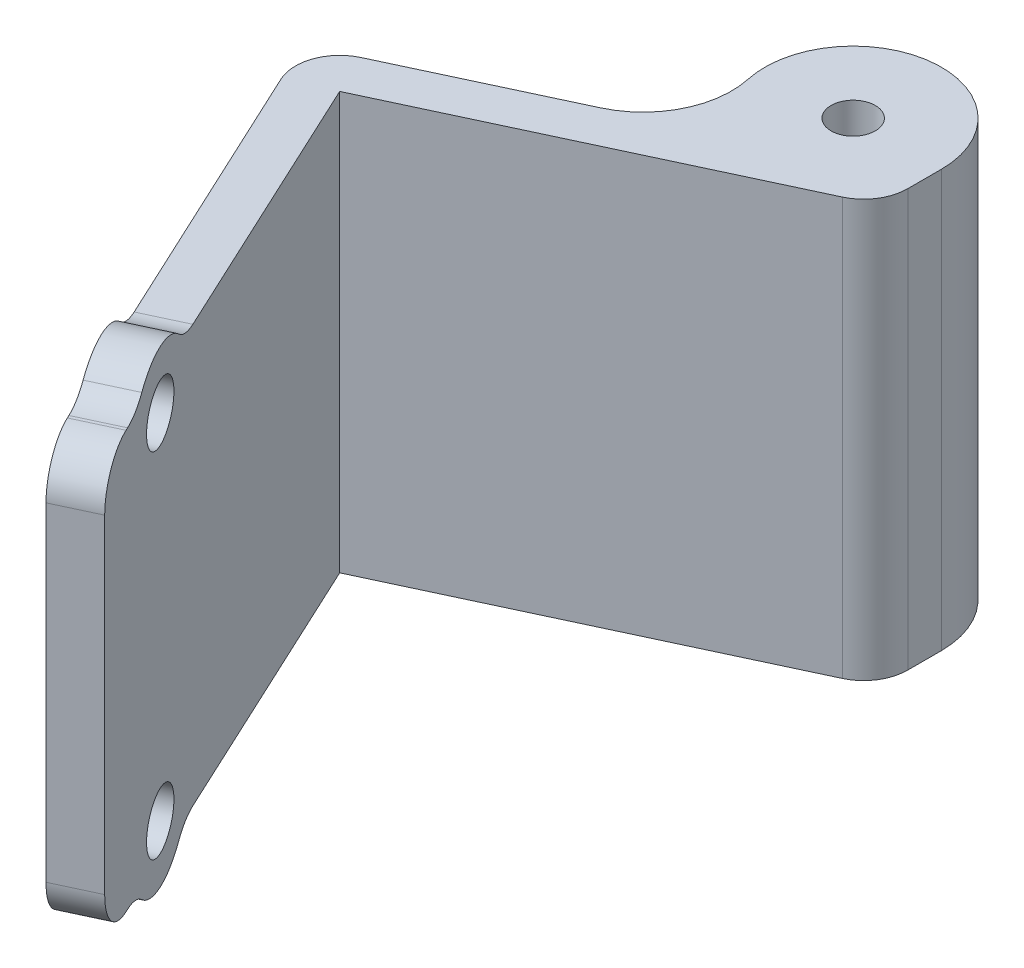
ISO-10303-21;
HEADER;
FILE_DESCRIPTION(('STEP AP214'),'2;1');
FILE_NAME('part.step','',(''),(''),'','','');
FILE_SCHEMA(('AUTOMOTIVE_DESIGN { 1 0 10303 214 1 1 1 1 }'));
ENDSEC;
DATA;
#1=APPLICATION_CONTEXT('core data for automotive mechanical design processes');
#2=APPLICATION_PROTOCOL_DEFINITION('international standard','automotive_design',2000,#1);
#3=PRODUCT_CONTEXT('',#1,'mechanical');
#4=PRODUCT('Part','Part','',(#3));
#5=PRODUCT_RELATED_PRODUCT_CATEGORY('part','',(#4));
#6=PRODUCT_DEFINITION_FORMATION('','',#4);
#7=PRODUCT_DEFINITION_CONTEXT('part definition',#1,'design');
#8=PRODUCT_DEFINITION('design','',#6,#7);
#9=PRODUCT_DEFINITION_SHAPE('','',#8);
#10=(LENGTH_UNIT() NAMED_UNIT(*) SI_UNIT(.MILLI.,.METRE.));
#11=(NAMED_UNIT(*) PLANE_ANGLE_UNIT() SI_UNIT($,.RADIAN.));
#12=(NAMED_UNIT(*) SI_UNIT($,.STERADIAN.) SOLID_ANGLE_UNIT());
#13=UNCERTAINTY_MEASURE_WITH_UNIT(LENGTH_MEASURE(1.E-05),#10,'distance_accuracy_value','');
#14=(GEOMETRIC_REPRESENTATION_CONTEXT(3) GLOBAL_UNCERTAINTY_ASSIGNED_CONTEXT((#13)) GLOBAL_UNIT_ASSIGNED_CONTEXT((#10,
#11,#12)) REPRESENTATION_CONTEXT('',''));
#15=CARTESIAN_POINT('',(0.,0.,0.));
#16=DIRECTION('',(0.,0.,1.));
#17=DIRECTION('',(1.,0.,0.));
#18=AXIS2_PLACEMENT_3D('',#15,#16,#17);
#19=CARTESIAN_POINT('',(-73.9974808663748,-364.96231219828,78.9202200200361));
#20=DIRECTION('',(0.,1.,0.));
#21=DIRECTION('',(0.,0.,1.));
#22=AXIS2_PLACEMENT_3D('',#19,#20,#21);
#23=CYLINDRICAL_SURFACE('',#22,2.5);
#24=CARTESIAN_POINT('',(-73.9974808663748,-11.8,78.9202200200361));
#25=DIRECTION('',(0.,-1.,0.));
#26=DIRECTION('',(0.,0.,-1.));
#27=AXIS2_PLACEMENT_3D('',#24,#25,#26);
#28=CIRCLE('',#27,2.5);
#29=CARTESIAN_POINT('',(-76.2632503339664,-11.8,79.9767656743879));
#30=VERTEX_POINT('',#29);
#31=CARTESIAN_POINT('',(-75.0540265207265,-11.8,76.6544505524445));
#32=VERTEX_POINT('',#31);
#33=EDGE_CURVE('E291',#30,#32,#28,.T.);
#34=ORIENTED_EDGE('',*,*,#33,.F.);
#35=DIRECTION('',(0.,-1.,0.));
#36=VECTOR('',#35,1.);
#37=CARTESIAN_POINT('',(-76.2632503339664,-364.96231219828,79.9767656743879));
#38=LINE('',#37,#36);
#39=CARTESIAN_POINT('',(-76.2632503339664,11.8,79.9767656743879));
#40=VERTEX_POINT('',#39);
#41=EDGE_CURVE('E447',#40,#30,#38,.T.);
#42=ORIENTED_EDGE('',*,*,#41,.F.);
#43=CARTESIAN_POINT('',(-73.9974808663748,11.8,78.9202200200361));
#44=DIRECTION('',(0.,1.,0.));
#45=DIRECTION('',(0.,0.,-1.));
#46=AXIS2_PLACEMENT_3D('',#43,#44,#45);
#47=CIRCLE('',#46,2.5);
#48=CARTESIAN_POINT('',(-75.0540265207265,11.8,76.6544505524445));
#49=VERTEX_POINT('',#48);
#50=EDGE_CURVE('E343',#49,#40,#47,.T.);
#51=ORIENTED_EDGE('',*,*,#50,.F.);
#52=DIRECTION('',(0.,1.,0.));
#53=VECTOR('',#52,1.);
#54=CARTESIAN_POINT('',(-75.0540265207265,-364.96231219828,76.6544505524445));
#55=LINE('',#54,#53);
#56=EDGE_CURVE('E357',#32,#49,#55,.T.);
#57=ORIENTED_EDGE('',*,*,#56,.F.);
#58=EDGE_LOOP('',(#34,#42,#51,#57));
#59=FACE_BOUND('',#58,.T.);
#60=ADVANCED_FACE('F17',(#59),#23,.T.);
#61=CARTESIAN_POINT('',(-55.6524017645318,-364.96231219828,67.6073243479813));
#62=DIRECTION('',(0.,1.,0.));
#63=DIRECTION('',(0.,0.,1.));
#64=AXIS2_PLACEMENT_3D('',#61,#62,#63);
#65=CYLINDRICAL_SURFACE('',#64,2.5);
#66=CARTESIAN_POINT('',(-55.6524017645318,-11.8,67.6073243479813));
#67=DIRECTION('',(0.,-1.,0.));
#68=DIRECTION('',(0.,0.,-1.));
#69=AXIS2_PLACEMENT_3D('',#66,#67,#68);
#70=CIRCLE('',#69,2.5);
#71=CARTESIAN_POINT('',(-53.1524017645318,-11.8,67.6073243479813));
#72=VERTEX_POINT('',#71);
#73=CARTESIAN_POINT('',(-54.5958561101801,-11.8,69.873093815573));
#74=VERTEX_POINT('',#73);
#75=EDGE_CURVE('E346',#72,#74,#70,.T.);
#76=ORIENTED_EDGE('',*,*,#75,.F.);
#77=DIRECTION('',(0.,-1.,0.));
#78=VECTOR('',#77,1.);
#79=CARTESIAN_POINT('',(-53.1524017645318,-364.96231219828,67.6073243479813));
#80=LINE('',#79,#78);
#81=CARTESIAN_POINT('',(-53.1524017645318,11.8,67.6073243479813));
#82=VERTEX_POINT('',#81);
#83=EDGE_CURVE('E377',#82,#72,#80,.T.);
#84=ORIENTED_EDGE('',*,*,#83,.F.);
#85=CARTESIAN_POINT('',(-55.6524017645318,11.8,67.6073243479813));
#86=DIRECTION('',(0.,1.,0.));
#87=DIRECTION('',(0.,0.,-1.));
#88=AXIS2_PLACEMENT_3D('',#85,#86,#87);
#89=CIRCLE('',#88,2.5);
#90=CARTESIAN_POINT('',(-54.5958561101801,11.8,69.873093815573));
#91=VERTEX_POINT('',#90);
#92=EDGE_CURVE('E279',#91,#82,#89,.T.);
#93=ORIENTED_EDGE('',*,*,#92,.F.);
#94=DIRECTION('',(0.,1.,0.));
#95=VECTOR('',#94,1.);
#96=CARTESIAN_POINT('',(-54.5958561101801,-364.96231219828,69.873093815573));
#97=LINE('',#96,#95);
#98=EDGE_CURVE('E329',#74,#91,#97,.T.);
#99=ORIENTED_EDGE('',*,*,#98,.F.);
#100=EDGE_LOOP('',(#76,#84,#93,#99));
#101=FACE_BOUND('',#100,.T.);
#102=ADVANCED_FACE('F489',(#101),#65,.T.);
#103=CARTESIAN_POINT('',(-64.5649090566531,-9.3,102.106187523128));
#104=DIRECTION('',(0.906307787036649,0.,-0.422618261740702));
#105=DIRECTION('',(-0.422618261740702,0.,-0.906307787036649));
#106=AXIS2_PLACEMENT_3D('',#103,#104,#105);
#107=CYLINDRICAL_SURFACE('',#106,2.5);
#108=CARTESIAN_POINT('',(-65.6977937904489,-9.3,102.634460350304));
#109=DIRECTION('',(-0.90630778703665,0.,0.422618261740699));
#110=DIRECTION('',(0.422618261740699,0.,0.90630778703665));
#111=AXIS2_PLACEMENT_3D('',#108,#109,#110);
#112=CIRCLE('',#111,2.5);
#113=CARTESIAN_POINT('',(-65.6977937904489,-11.8,102.634460350304));
#114=VERTEX_POINT('',#113);
#115=CARTESIAN_POINT('',(-64.6412481360972,-9.3,104.900229817896));
#116=VERTEX_POINT('',#115);
#117=EDGE_CURVE('E233',#114,#116,#112,.T.);
#118=ORIENTED_EDGE('',*,*,#117,.F.);
#119=DIRECTION('',(-0.906307787036649,0.,0.422618261740702));
#120=VECTOR('',#119,1.);
#121=CARTESIAN_POINT('',(-25.986248487577,-11.8,84.1166626584056));
#122=LINE('',#121,#120);
#123=CARTESIAN_POINT('',(-63.4320243228573,-11.8,101.577914695952));
#124=VERTEX_POINT('',#123);
#125=EDGE_CURVE('E249',#124,#114,#122,.T.);
#126=ORIENTED_EDGE('',*,*,#125,.F.);
#127=CARTESIAN_POINT('',(-63.4320243228573,-9.3,101.577914695952));
#128=DIRECTION('',(0.90630778703665,0.,-0.422618261740699));
#129=DIRECTION('',(-0.422618261740699,0.,-0.90630778703665));
#130=AXIS2_PLACEMENT_3D('',#127,#128,#129);
#131=CIRCLE('',#130,2.5);
#132=CARTESIAN_POINT('',(-62.3754786685055,-9.3,103.843684163544));
#133=VERTEX_POINT('',#132);
#134=EDGE_CURVE('E370',#133,#124,#131,.T.);
#135=ORIENTED_EDGE('',*,*,#134,.F.);
#136=DIRECTION('',(0.906307787036649,0.,-0.422618261740702));
#137=VECTOR('',#136,1.);
#138=CARTESIAN_POINT('',(-63.5083634023013,-9.3,104.37195699072));
#139=LINE('',#138,#137);
#140=EDGE_CURVE('E428',#116,#133,#139,.T.);
#141=ORIENTED_EDGE('',*,*,#140,.F.);
#142=EDGE_LOOP('',(#118,#126,#135,#141));
#143=FACE_BOUND('',#142,.T.);
#144=ADVANCED_FACE('F532',(#143),#107,.T.);
#145=CARTESIAN_POINT('',(-25.986248487577,9.3,84.1166626584056));
#146=DIRECTION('',(-0.906307787036649,0.,0.422618261740702));
#147=DIRECTION('',(0.422618261740702,0.,0.906307787036649));
#148=AXIS2_PLACEMENT_3D('',#145,#146,#147);
#149=CYLINDRICAL_SURFACE('',#148,2.5);
#150=CARTESIAN_POINT('',(-65.6977937904489,9.3,102.634460350304));
#151=DIRECTION('',(-0.90630778703665,0.,0.422618261740699));
#152=DIRECTION('',(0.422618261740699,0.,0.90630778703665));
#153=AXIS2_PLACEMENT_3D('',#150,#151,#152);
#154=CIRCLE('',#153,2.5);
#155=CARTESIAN_POINT('',(-64.6412481360972,9.3,104.900229817896));
#156=VERTEX_POINT('',#155);
#157=CARTESIAN_POINT('',(-65.6977937904489,11.8,102.634460350304));
#158=VERTEX_POINT('',#157);
#159=EDGE_CURVE('E437',#156,#158,#154,.T.);
#160=ORIENTED_EDGE('',*,*,#159,.F.);
#161=DIRECTION('',(-0.906307787036649,0.,0.422618261740702));
#162=VECTOR('',#161,1.);
#163=CARTESIAN_POINT('',(-64.6412481360972,9.3,104.900229817896));
#164=LINE('',#163,#162);
#165=CARTESIAN_POINT('',(-62.3754786685055,9.3,103.843684163544));
#166=VERTEX_POINT('',#165);
#167=EDGE_CURVE('E299',#166,#156,#164,.T.);
#168=ORIENTED_EDGE('',*,*,#167,.F.);
#169=CARTESIAN_POINT('',(-63.4320243228573,9.3,101.577914695952));
#170=DIRECTION('',(0.90630778703665,0.,-0.422618261740699));
#171=DIRECTION('',(-0.422618261740699,0.,-0.90630778703665));
#172=AXIS2_PLACEMENT_3D('',#169,#170,#171);
#173=CIRCLE('',#172,2.5);
#174=CARTESIAN_POINT('',(-63.4320243228573,11.8,101.577914695952));
#175=VERTEX_POINT('',#174);
#176=EDGE_CURVE('E406',#175,#166,#173,.T.);
#177=ORIENTED_EDGE('',*,*,#176,.F.);
#178=DIRECTION('',(0.906307787036649,0.,-0.422618261740702));
#179=VECTOR('',#178,1.);
#180=CARTESIAN_POINT('',(-63.4320243228573,11.8,101.577914695952));
#181=LINE('',#180,#179);
#182=EDGE_CURVE('E263',#158,#175,#181,.T.);
#183=ORIENTED_EDGE('',*,*,#182,.F.);
#184=EDGE_LOOP('',(#160,#168,#177,#183));
#185=FACE_BOUND('',#184,.T.);
#186=ADVANCED_FACE('F525',(#185),#149,.T.);
#187=CARTESIAN_POINT('',(-63.5073841688245,-14.3,101.411572581581));
#188=DIRECTION('',(-0.90630778703665,0.,0.422618261740699));
#189=DIRECTION('',(0.422618261740699,0.,0.90630778703665));
#190=AXIS2_PLACEMENT_3D('',#187,#188,#189);
#191=CYLINDRICAL_SURFACE('',#190,2.5);
#192=CARTESIAN_POINT('',(-63.5091967843986,-14.3,101.412417818104));
#193=DIRECTION('',(-0.90630778703665,0.,0.422618261740699));
#194=DIRECTION('',(-0.422618261740699,0.,-0.90630778703665));
#195=AXIS2_PLACEMENT_3D('',#192,#193,#194);
#196=CIRCLE('',#195,2.5);
#197=CARTESIAN_POINT('',(-63.5091967843986,-11.8,101.412417818104));
#198=VERTEX_POINT('',#197);
#199=CARTESIAN_POINT('',(-64.2106318215384,-12.4304347826087,99.9081855266702));
#200=VERTEX_POINT('',#199);
#201=EDGE_CURVE('E239',#198,#200,#196,.T.);
#202=ORIENTED_EDGE('',*,*,#201,.F.);
#203=DIRECTION('',(0.90630778703665,0.,-0.422618261740699));
#204=VECTOR('',#203,1.);
#205=CARTESIAN_POINT('',(-63.5091967843986,-11.8,101.412417818104));
#206=LINE('',#205,#204);
#207=CARTESIAN_POINT('',(-65.7749662519902,-11.8,102.468963472456));
#208=VERTEX_POINT('',#207);
#209=EDGE_CURVE('E236',#208,#198,#206,.T.);
#210=ORIENTED_EDGE('',*,*,#209,.F.);
#211=CARTESIAN_POINT('',(-65.7749662519902,-14.3,102.468963472456));
#212=DIRECTION('',(0.90630778703665,0.,-0.422618261740699));
#213=DIRECTION('',(0.422618261740699,0.,0.90630778703665));
#214=AXIS2_PLACEMENT_3D('',#211,#212,#213);
#215=CIRCLE('',#214,2.5);
#216=CARTESIAN_POINT('',(-66.47640128913,-12.4304347826087,100.964731181022));
#217=VERTEX_POINT('',#216);
#218=EDGE_CURVE('E222',#217,#208,#215,.T.);
#219=ORIENTED_EDGE('',*,*,#218,.F.);
#220=DIRECTION('',(-0.90630778703665,0.,0.422618261740699));
#221=VECTOR('',#220,1.);
#222=CARTESIAN_POINT('',(-64.2088192059643,-12.4304347826087,99.9073402901467));
#223=LINE('',#222,#221);
#224=EDGE_CURVE('E11',#200,#217,#223,.T.);
#225=ORIENTED_EDGE('',*,*,#224,.F.);
#226=EDGE_LOOP('',(#202,#210,#219,#225));
#227=FACE_BOUND('',#226,.T.);
#228=ADVANCED_FACE('F237',(#227),#191,.F.);
#229=CARTESIAN_POINT('',(-66.7339853396676,-14.3,94.4921040409837));
#230=DIRECTION('',(-0.90630778703665,0.,0.422618261740699));
#231=DIRECTION('',(0.422618261740699,0.,0.90630778703665));
#232=AXIS2_PLACEMENT_3D('',#229,#230,#231);
#233=CYLINDRICAL_SURFACE('',#232,2.5);
#234=CARTESIAN_POINT('',(-69.0015674228332,-14.3,95.5494949318589));
#235=DIRECTION('',(0.90630778703665,0.,-0.422618261740699));
#236=DIRECTION('',(0.422618261740699,0.,0.90630778703665));
#237=AXIS2_PLACEMENT_3D('',#234,#235,#236);
#238=CIRCLE('',#237,2.5);
#239=CARTESIAN_POINT('',(-69.0015674228332,-11.8,95.5494949318589));
#240=VERTEX_POINT('',#239);
#241=CARTESIAN_POINT('',(-68.3001323856935,-12.4304347826087,97.0537272232931));
#242=VERTEX_POINT('',#241);
#243=EDGE_CURVE('E455',#240,#242,#238,.T.);
#244=ORIENTED_EDGE('',*,*,#243,.F.);
#245=DIRECTION('',(-0.90630778703665,0.,0.422618261740699));
#246=VECTOR('',#245,1.);
#247=CARTESIAN_POINT('',(-69.0015674228332,-11.8,95.5494949318589));
#248=LINE('',#247,#246);
#249=CARTESIAN_POINT('',(-66.7357979552416,-11.8,94.4929492775072));
#250=VERTEX_POINT('',#249);
#251=EDGE_CURVE('E288',#250,#240,#248,.T.);
#252=ORIENTED_EDGE('',*,*,#251,.F.);
#253=CARTESIAN_POINT('',(-66.7357979552416,-14.3,94.4929492775072));
#254=DIRECTION('',(-0.90630778703665,0.,0.422618261740699));
#255=DIRECTION('',(-0.422618261740699,0.,-0.90630778703665));
#256=AXIS2_PLACEMENT_3D('',#253,#254,#255);
#257=CIRCLE('',#256,2.5);
#258=CARTESIAN_POINT('',(-66.0343629181018,-12.4304347826087,95.9971815689414));
#259=VERTEX_POINT('',#258);
#260=EDGE_CURVE('E418',#259,#250,#257,.T.);
#261=ORIENTED_EDGE('',*,*,#260,.F.);
#262=DIRECTION('',(0.90630778703665,0.,-0.422618261740699));
#263=VECTOR('',#262,1.);
#264=CARTESIAN_POINT('',(-66.0325503025278,-12.4304347826087,95.9963363324179));
#265=LINE('',#264,#263);
#266=EDGE_CURVE('E25',#242,#259,#265,.T.);
#267=ORIENTED_EDGE('',*,*,#266,.F.);
#268=EDGE_LOOP('',(#244,#252,#261,#267));
#269=FACE_BOUND('',#268,.T.);
#270=ADVANCED_FACE('F502',(#269),#233,.F.);
#271=CARTESIAN_POINT('',(-63.5073841688245,14.3,101.411572581581));
#272=DIRECTION('',(-0.90630778703665,0.,0.422618261740699));
#273=DIRECTION('',(0.422618261740699,0.,0.90630778703665));
#274=AXIS2_PLACEMENT_3D('',#271,#272,#273);
#275=CYLINDRICAL_SURFACE('',#274,2.5);
#276=CARTESIAN_POINT('',(-63.5091967843986,14.3,101.412417818104));
#277=DIRECTION('',(-0.90630778703665,0.,0.422618261740699));
#278=DIRECTION('',(-0.422618261740699,0.,-0.90630778703665));
#279=AXIS2_PLACEMENT_3D('',#276,#277,#278);
#280=CIRCLE('',#279,2.5);
#281=CARTESIAN_POINT('',(-64.2106318215384,12.4304347826087,99.9081855266702));
#282=VERTEX_POINT('',#281);
#283=CARTESIAN_POINT('',(-63.5091967843986,11.8,101.412417818104));
#284=VERTEX_POINT('',#283);
#285=EDGE_CURVE('E304',#282,#284,#280,.T.);
#286=ORIENTED_EDGE('',*,*,#285,.F.);
#287=DIRECTION('',(0.90630778703665,0.,-0.422618261740699));
#288=VECTOR('',#287,1.);
#289=CARTESIAN_POINT('',(-64.2088192059643,12.4304347826087,99.9073402901467));
#290=LINE('',#289,#288);
#291=CARTESIAN_POINT('',(-66.47640128913,12.4304347826087,100.964731181022));
#292=VERTEX_POINT('',#291);
#293=EDGE_CURVE('E280',#292,#282,#290,.T.);
#294=ORIENTED_EDGE('',*,*,#293,.F.);
#295=CARTESIAN_POINT('',(-65.7749662519902,14.3,102.468963472456));
#296=DIRECTION('',(0.90630778703665,0.,-0.422618261740699));
#297=DIRECTION('',(0.422618261740699,0.,0.90630778703665));
#298=AXIS2_PLACEMENT_3D('',#295,#296,#297);
#299=CIRCLE('',#298,2.5);
#300=CARTESIAN_POINT('',(-65.7749662519902,11.8,102.468963472456));
#301=VERTEX_POINT('',#300);
#302=EDGE_CURVE('E387',#301,#292,#299,.T.);
#303=ORIENTED_EDGE('',*,*,#302,.F.);
#304=DIRECTION('',(-0.90630778703665,0.,0.422618261740699));
#305=VECTOR('',#304,1.);
#306=CARTESIAN_POINT('',(-26.0634209491183,11.8,83.9511657805578));
#307=LINE('',#306,#305);
#308=EDGE_CURVE('E259',#284,#301,#307,.T.);
#309=ORIENTED_EDGE('',*,*,#308,.F.);
#310=EDGE_LOOP('',(#286,#294,#303,#309));
#311=FACE_BOUND('',#310,.T.);
#312=ADVANCED_FACE('F518',(#311),#275,.F.);
#313=CARTESIAN_POINT('',(-66.7339853396676,14.3,94.4921040409837));
#314=DIRECTION('',(-0.90630778703665,0.,0.422618261740699));
#315=DIRECTION('',(0.422618261740699,0.,0.90630778703665));
#316=AXIS2_PLACEMENT_3D('',#313,#314,#315);
#317=CYLINDRICAL_SURFACE('',#316,2.5);
#318=CARTESIAN_POINT('',(-69.0015674228332,14.3,95.5494949318589));
#319=DIRECTION('',(0.90630778703665,0.,-0.422618261740699));
#320=DIRECTION('',(0.422618261740699,0.,0.90630778703665));
#321=AXIS2_PLACEMENT_3D('',#318,#319,#320);
#322=CIRCLE('',#321,2.5);
#323=CARTESIAN_POINT('',(-68.3001323856935,12.4304347826087,97.0537272232931));
#324=VERTEX_POINT('',#323);
#325=CARTESIAN_POINT('',(-69.0015674228332,11.8,95.5494949318589));
#326=VERTEX_POINT('',#325);
#327=EDGE_CURVE('E386',#324,#326,#322,.T.);
#328=ORIENTED_EDGE('',*,*,#327,.F.);
#329=DIRECTION('',(-0.90630778703665,0.,0.422618261740699));
#330=VECTOR('',#329,1.);
#331=CARTESIAN_POINT('',(-66.0325503025278,12.4304347826087,95.9963363324179));
#332=LINE('',#331,#330);
#333=CARTESIAN_POINT('',(-66.0343629181018,12.4304347826087,95.9971815689414));
#334=VERTEX_POINT('',#333);
#335=EDGE_CURVE('E283',#334,#324,#332,.T.);
#336=ORIENTED_EDGE('',*,*,#335,.F.);
#337=CARTESIAN_POINT('',(-66.7357979552416,14.3,94.4929492775072));
#338=DIRECTION('',(-0.90630778703665,0.,0.422618261740699));
#339=DIRECTION('',(-0.422618261740699,0.,-0.90630778703665));
#340=AXIS2_PLACEMENT_3D('',#337,#338,#339);
#341=CIRCLE('',#340,2.5);
#342=CARTESIAN_POINT('',(-66.7357979552416,11.8,94.4929492775072));
#343=VERTEX_POINT('',#342);
#344=EDGE_CURVE('E317',#343,#334,#341,.T.);
#345=ORIENTED_EDGE('',*,*,#344,.F.);
#346=DIRECTION('',(0.90630778703665,0.,-0.422618261740699));
#347=VECTOR('',#346,1.);
#348=CARTESIAN_POINT('',(-29.2900221199614,11.8,77.0316972399606));
#349=LINE('',#348,#347);
#350=EDGE_CURVE('E308',#326,#343,#349,.T.);
#351=ORIENTED_EDGE('',*,*,#350,.F.);
#352=EDGE_LOOP('',(#328,#336,#345,#351));
#353=FACE_BOUND('',#352,.T.);
#354=ADVANCED_FACE('F510',(#353),#317,.F.);
#355=CARTESIAN_POINT('',(-44.7305721614955,-10.,88.4437726586401));
#356=DIRECTION('',(-0.90630778703665,0.,0.422618261740699));
#357=DIRECTION('',(0.422618261740699,0.,0.90630778703665));
#358=AXIS2_PLACEMENT_3D('',#355,#356,#357);
#359=CYLINDRICAL_SURFACE('',#358,1.6);
#360=CARTESIAN_POINT('',(-67.3882668374117,-10.,99.0092292021575));
#361=DIRECTION('',(-0.90630778703665,0.,0.422618261740699));
#362=DIRECTION('',(0.422618261740699,0.,0.90630778703665));
#363=AXIS2_PLACEMENT_3D('',#360,#361,#362);
#364=CIRCLE('',#363,1.6);
#365=CARTESIAN_POINT('',(-66.7120776186266,-10.,100.459321661416));
#366=VERTEX_POINT('',#365);
#367=EDGE_CURVE('E431',#366,#366,#364,.T.);
#368=ORIENTED_EDGE('',*,*,#367,.T.);
#369=EDGE_LOOP('',(#368));
#370=FACE_BOUND('',#369,.T.);
#371=CARTESIAN_POINT('',(-65.1224973698201,-10.,97.9526835478058));
#372=DIRECTION('',(0.90630778703665,0.,-0.422618261740699));
#373=DIRECTION('',(-0.422618261740699,0.,-0.90630778703665));
#374=AXIS2_PLACEMENT_3D('',#371,#372,#373);
#375=CIRCLE('',#374,1.6);
#376=CARTESIAN_POINT('',(-65.7986865886052,-10.,96.5025910885472));
#377=VERTEX_POINT('',#376);
#378=EDGE_CURVE('E328',#377,#377,#375,.T.);
#379=ORIENTED_EDGE('',*,*,#378,.T.);
#380=EDGE_LOOP('',(#379));
#381=FACE_BOUND('',#380,.T.);
#382=ADVANCED_FACE('F610',(#370,#381),#359,.F.);
#383=CARTESIAN_POINT('',(-44.7305721614955,10.,88.4437726586401));
#384=DIRECTION('',(-0.90630778703665,0.,0.422618261740699));
#385=DIRECTION('',(0.422618261740699,0.,0.90630778703665));
#386=AXIS2_PLACEMENT_3D('',#383,#384,#385);
#387=CYLINDRICAL_SURFACE('',#386,1.6);
#388=CARTESIAN_POINT('',(-67.3882668374117,10.,99.0092292021575));
#389=DIRECTION('',(-0.90630778703665,0.,0.422618261740699));
#390=DIRECTION('',(0.422618261740699,0.,0.90630778703665));
#391=AXIS2_PLACEMENT_3D('',#388,#389,#390);
#392=CIRCLE('',#391,1.6);
#393=CARTESIAN_POINT('',(-66.7120776186266,10.,100.459321661416));
#394=VERTEX_POINT('',#393);
#395=EDGE_CURVE('E434',#394,#394,#392,.T.);
#396=ORIENTED_EDGE('',*,*,#395,.T.);
#397=EDGE_LOOP('',(#396));
#398=FACE_BOUND('',#397,.T.);
#399=CARTESIAN_POINT('',(-65.1224973698201,10.,97.9526835478058));
#400=DIRECTION('',(0.90630778703665,0.,-0.422618261740699));
#401=DIRECTION('',(-0.422618261740699,0.,-0.90630778703665));
#402=AXIS2_PLACEMENT_3D('',#399,#400,#401);
#403=CIRCLE('',#402,1.6);
#404=CARTESIAN_POINT('',(-65.7986865886052,10.,96.5025910885472));
#405=VERTEX_POINT('',#404);
#406=EDGE_CURVE('E403',#405,#405,#403,.T.);
#407=ORIENTED_EDGE('',*,*,#406,.T.);
#408=EDGE_LOOP('',(#407));
#409=FACE_BOUND('',#408,.T.);
#410=ADVANCED_FACE('F621',(#398,#409),#387,.F.);
#411=CARTESIAN_POINT('',(-65.120684754246,-10.,97.9518383112823));
#412=DIRECTION('',(-0.90630778703665,0.,0.422618261740699));
#413=DIRECTION('',(0.422618261740699,0.,0.90630778703665));
#414=AXIS2_PLACEMENT_3D('',#411,#412,#413);
#415=CYLINDRICAL_SURFACE('',#414,3.25);
#416=CARTESIAN_POINT('',(-67.3882668374118,-10.,99.0092292021575));
#417=DIRECTION('',(-0.90630778703665,0.,0.422618261740699));
#418=DIRECTION('',(0.422618261740699,0.,0.90630778703665));
#419=AXIS2_PLACEMENT_3D('',#416,#417,#418);
#420=CIRCLE('',#419,3.25);
#421=EDGE_CURVE('E230',#242,#217,#420,.T.);
#422=ORIENTED_EDGE('',*,*,#421,.F.);
#423=ORIENTED_EDGE('',*,*,#266,.T.);
#424=CARTESIAN_POINT('',(-65.1224973698201,-10.,97.9526835478058));
#425=DIRECTION('',(-0.90630778703665,0.,0.422618261740699));
#426=DIRECTION('',(-0.422618261740699,0.,-0.90630778703665));
#427=AXIS2_PLACEMENT_3D('',#424,#425,#426);
#428=CIRCLE('',#427,3.25);
#429=EDGE_CURVE('E415',#259,#200,#428,.T.);
#430=ORIENTED_EDGE('',*,*,#429,.T.);
#431=ORIENTED_EDGE('',*,*,#224,.T.);
#432=EDGE_LOOP('',(#422,#423,#430,#431));
#433=FACE_BOUND('',#432,.T.);
#434=ADVANCED_FACE('F633',(#433),#415,.T.);
#435=CARTESIAN_POINT('',(-65.120684754246,10.,97.9518383112823));
#436=DIRECTION('',(-0.90630778703665,0.,0.422618261740699));
#437=DIRECTION('',(0.422618261740699,0.,0.90630778703665));
#438=AXIS2_PLACEMENT_3D('',#435,#436,#437);
#439=CYLINDRICAL_SURFACE('',#438,3.25);
#440=CARTESIAN_POINT('',(-65.1224973698201,10.,97.9526835478058));
#441=DIRECTION('',(-0.90630778703665,0.,0.422618261740699));
#442=DIRECTION('',(-0.422618261740699,0.,-0.90630778703665));
#443=AXIS2_PLACEMENT_3D('',#440,#441,#442);
#444=CIRCLE('',#443,3.25);
#445=EDGE_CURVE('E313',#282,#334,#444,.T.);
#446=ORIENTED_EDGE('',*,*,#445,.T.);
#447=ORIENTED_EDGE('',*,*,#335,.T.);
#448=CARTESIAN_POINT('',(-67.3882668374118,10.,99.0092292021575));
#449=DIRECTION('',(-0.90630778703665,0.,0.422618261740699));
#450=DIRECTION('',(0.422618261740699,0.,0.90630778703665));
#451=AXIS2_PLACEMENT_3D('',#448,#449,#450);
#452=CIRCLE('',#451,3.25);
#453=EDGE_CURVE('E382',#292,#324,#452,.T.);
#454=ORIENTED_EDGE('',*,*,#453,.F.);
#455=ORIENTED_EDGE('',*,*,#293,.T.);
#456=EDGE_LOOP('',(#446,#447,#454,#455));
#457=FACE_BOUND('',#456,.T.);
#458=ADVANCED_FACE('F515',(#457),#439,.T.);
#459=CARTESIAN_POINT('',(-43.2474017645319,-11.8,47.1));
#460=DIRECTION('',(0.,-1.,0.));
#461=DIRECTION('',(0.,0.,-1.));
#462=AXIS2_PLACEMENT_3D('',#459,#460,#461);
#463=PLANE('',#462);
#464=CARTESIAN_POINT('',(-58.1524017645318,-11.8,65.7));
#465=DIRECTION('',(0.,-1.,0.));
#466=DIRECTION('',(0.,0.,-1.));
#467=AXIS2_PLACEMENT_3D('',#464,#465,#466);
#468=CIRCLE('',#467,1.25);
#469=CARTESIAN_POINT('',(-58.1524017645318,-11.8,64.45));
#470=VERTEX_POINT('',#469);
#471=EDGE_CURVE('E350',#470,#470,#468,.T.);
#472=ORIENTED_EDGE('',*,*,#471,.F.);
#473=EDGE_LOOP('',(#472));
#474=FACE_BOUND('',#473,.T.);
#475=DIRECTION('',(-0.422618261740699,0.,-0.90630778703665));
#476=VECTOR('',#475,1.);
#477=CARTESIAN_POINT('',(-68.1864797674402,-11.8,91.3819520917901));
#478=LINE('',#477,#476);
#479=CARTESIAN_POINT('',(-73.9974808663748,-11.8,78.9202200200362));
#480=VERTEX_POINT('',#479);
#481=EDGE_CURVE('E398',#250,#480,#478,.T.);
#482=ORIENTED_EDGE('',*,*,#481,.F.);
#483=ORIENTED_EDGE('',*,*,#251,.T.);
#484=DIRECTION('',(0.422618261740699,0.,0.90630778703665));
#485=VECTOR('',#484,1.);
#486=CARTESIAN_POINT('',(-70.9805220622077,-11.8,91.305613012346));
#487=LINE('',#486,#485);
#488=EDGE_CURVE('E451',#30,#240,#487,.T.);
#489=ORIENTED_EDGE('',*,*,#488,.F.);
#490=ORIENTED_EDGE('',*,*,#33,.T.);
#491=DIRECTION('',(-0.90630778703665,0.,0.422618261740699));
#492=VECTOR('',#491,1.);
#493=CARTESIAN_POINT('',(-71.5665618687319,-11.8,75.0282190776746));
#494=LINE('',#493,#492);
#495=CARTESIAN_POINT('',(-65.8133277491457,-11.8,72.3454419485529));
#496=VERTEX_POINT('',#495);
#497=EDGE_CURVE('E353',#496,#32,#494,.T.);
#498=ORIENTED_EDGE('',*,*,#497,.F.);
#499=CARTESIAN_POINT('',(-67.9264190578492,-11.8,67.8139030133696));
#500=DIRECTION('',(0.,-1.,0.));
#501=DIRECTION('',(0.,0.,-1.));
#502=AXIS2_PLACEMENT_3D('',#499,#500,#501);
#503=CIRCLE('',#502,5.);
#504=CARTESIAN_POINT('',(-63.0394104111905,-11.8,66.7569515066848));
#505=VERTEX_POINT('',#504);
#506=EDGE_CURVE('E271',#505,#496,#503,.T.);
#507=ORIENTED_EDGE('',*,*,#506,.F.);
#508=CARTESIAN_POINT('',(-58.1524017645318,-11.8,65.7));
#509=DIRECTION('',(0.,-1.,0.));
#510=DIRECTION('',(0.,0.,-1.));
#511=AXIS2_PLACEMENT_3D('',#508,#509,#510);
#512=CIRCLE('',#511,5.);
#513=CARTESIAN_POINT('',(-53.1524017645318,-11.8,65.7));
#514=VERTEX_POINT('',#513);
#515=EDGE_CURVE('E270',#505,#514,#512,.T.);
#516=ORIENTED_EDGE('',*,*,#515,.T.);
#517=DIRECTION('',(0.,0.,1.));
#518=VECTOR('',#517,1.);
#519=CARTESIAN_POINT('',(-53.1524017645318,-11.8,67.45));
#520=LINE('',#519,#518);
#521=EDGE_CURVE('E381',#514,#72,#520,.T.);
#522=ORIENTED_EDGE('',*,*,#521,.T.);
#523=ORIENTED_EDGE('',*,*,#75,.T.);
#524=DIRECTION('',(-0.90630778703665,0.,0.4226182617407));
#525=VECTOR('',#524,1.);
#526=CARTESIAN_POINT('',(-63.5749413154533,-11.8,74.0601100100181));
#527=LINE('',#526,#525);
#528=EDGE_CURVE('E391',#74,#480,#527,.T.);
#529=ORIENTED_EDGE('',*,*,#528,.T.);
#530=EDGE_LOOP('',(#482,#483,#489,#490,#498,#507,#516,#522,#523,#529));
#531=FACE_BOUND('',#530,.T.);
#532=ADVANCED_FACE('F468',(#474,#531),#463,.T.);
#533=CARTESIAN_POINT('',(-70.9805220622077,-364.96231219828,91.305613012346));
#534=DIRECTION('',(-0.90630778703665,0.,0.422618261740699));
#535=DIRECTION('',(0.,1.,0.));
#536=AXIS2_PLACEMENT_3D('',#533,#534,#535);
#537=PLANE('',#536);
#538=DIRECTION('',(0.,1.,0.));
#539=VECTOR('',#538,1.);
#540=CARTESIAN_POINT('',(-64.6412481360972,-364.96231219828,104.900229817896));
#541=LINE('',#540,#539);
#542=EDGE_CURVE('E303',#116,#156,#541,.T.);
#543=ORIENTED_EDGE('',*,*,#542,.T.);
#544=ORIENTED_EDGE('',*,*,#159,.T.);
#545=DIRECTION('',(0.422618261740699,0.,0.90630778703665));
#546=VECTOR('',#545,1.);
#547=CARTESIAN_POINT('',(-70.9805220622077,11.8,91.305613012346));
#548=LINE('',#547,#546);
#549=EDGE_CURVE('E260',#301,#158,#548,.T.);
#550=ORIENTED_EDGE('',*,*,#549,.F.);
#551=ORIENTED_EDGE('',*,*,#302,.T.);
#552=ORIENTED_EDGE('',*,*,#453,.T.);
#553=ORIENTED_EDGE('',*,*,#327,.T.);
#554=DIRECTION('',(0.422618261740699,0.,0.90630778703665));
#555=VECTOR('',#554,1.);
#556=CARTESIAN_POINT('',(-70.9805220622077,11.8,91.305613012346));
#557=LINE('',#556,#555);
#558=EDGE_CURVE('E307',#40,#326,#557,.T.);
#559=ORIENTED_EDGE('',*,*,#558,.F.);
#560=ORIENTED_EDGE('',*,*,#41,.T.);
#561=ORIENTED_EDGE('',*,*,#488,.T.);
#562=ORIENTED_EDGE('',*,*,#243,.T.);
#563=ORIENTED_EDGE('',*,*,#421,.T.);
#564=ORIENTED_EDGE('',*,*,#218,.T.);
#565=DIRECTION('',(0.422618261740699,0.,0.90630778703665));
#566=VECTOR('',#565,1.);
#567=CARTESIAN_POINT('',(-70.9805220622077,-11.8,91.305613012346));
#568=LINE('',#567,#566);
#569=EDGE_CURVE('E228',#208,#114,#568,.T.);
#570=ORIENTED_EDGE('',*,*,#569,.T.);
#571=ORIENTED_EDGE('',*,*,#117,.T.);
#572=EDGE_LOOP('',(#543,#544,#550,#551,#552,#553,#559,#560,#561,#562,#563,#564,#570,#571));
#573=FACE_BOUND('',#572,.T.);
#574=ORIENTED_EDGE('',*,*,#395,.F.);
#575=EDGE_LOOP('',(#574));
#576=FACE_BOUND('',#575,.T.);
#577=ORIENTED_EDGE('',*,*,#367,.F.);
#578=EDGE_LOOP('',(#577));
#579=FACE_BOUND('',#578,.T.);
#580=ADVANCED_FACE('F225',(#573,#576,#579),#537,.T.);
#581=CARTESIAN_POINT('',(-63.5083634023013,-364.96231219828,104.37195699072));
#582=DIRECTION('',(0.422618261740702,0.,0.906307787036649));
#583=DIRECTION('',(0.,-1.,0.));
#584=AXIS2_PLACEMENT_3D('',#581,#582,#583);
#585=PLANE('',#584);
#586=DIRECTION('',(0.,1.,0.));
#587=VECTOR('',#586,1.);
#588=CARTESIAN_POINT('',(-62.3754786685055,-364.96231219828,103.843684163544));
#589=LINE('',#588,#587);
#590=EDGE_CURVE('E373',#133,#166,#589,.T.);
#591=ORIENTED_EDGE('',*,*,#590,.T.);
#592=ORIENTED_EDGE('',*,*,#167,.T.);
#593=ORIENTED_EDGE('',*,*,#542,.F.);
#594=ORIENTED_EDGE('',*,*,#140,.T.);
#595=EDGE_LOOP('',(#591,#592,#593,#594));
#596=FACE_BOUND('',#595,.T.);
#597=ADVANCED_FACE('F528',(#596),#585,.T.);
#598=CARTESIAN_POINT('',(-68.1864797674402,-364.96231219828,91.3819520917901));
#599=DIRECTION('',(0.90630778703665,0.,-0.422618261740699));
#600=DIRECTION('',(0.,-1.,0.));
#601=AXIS2_PLACEMENT_3D('',#598,#599,#600);
#602=PLANE('',#601);
#603=DIRECTION('',(-0.422618261740699,0.,-0.90630778703665));
#604=VECTOR('',#603,1.);
#605=CARTESIAN_POINT('',(-68.1864797674402,11.8,91.3819520917901));
#606=LINE('',#605,#604);
#607=EDGE_CURVE('E255',#175,#284,#606,.T.);
#608=ORIENTED_EDGE('',*,*,#607,.F.);
#609=ORIENTED_EDGE('',*,*,#176,.T.);
#610=ORIENTED_EDGE('',*,*,#590,.F.);
#611=ORIENTED_EDGE('',*,*,#134,.T.);
#612=DIRECTION('',(-0.422618261740699,0.,-0.90630778703665));
#613=VECTOR('',#612,1.);
#614=CARTESIAN_POINT('',(-68.1864797674402,-11.8,91.3819520917901));
#615=LINE('',#614,#613);
#616=EDGE_CURVE('E244',#124,#198,#615,.T.);
#617=ORIENTED_EDGE('',*,*,#616,.T.);
#618=ORIENTED_EDGE('',*,*,#201,.T.);
#619=ORIENTED_EDGE('',*,*,#429,.F.);
#620=ORIENTED_EDGE('',*,*,#260,.T.);
#621=ORIENTED_EDGE('',*,*,#481,.T.);
#622=DIRECTION('',(0.,1.,0.));
#623=VECTOR('',#622,1.);
#624=CARTESIAN_POINT('',(-73.9974808663748,-364.96231219828,78.9202200200362));
#625=LINE('',#624,#623);
#626=CARTESIAN_POINT('',(-73.9974808663748,11.8,78.9202200200362));
#627=VERTEX_POINT('',#626);
#628=EDGE_CURVE('E325',#480,#627,#625,.T.);
#629=ORIENTED_EDGE('',*,*,#628,.T.);
#630=DIRECTION('',(-0.422618261740699,0.,-0.90630778703665));
#631=VECTOR('',#630,1.);
#632=CARTESIAN_POINT('',(-68.1864797674402,11.8,91.3819520917901));
#633=LINE('',#632,#631);
#634=EDGE_CURVE('E312',#343,#627,#633,.T.);
#635=ORIENTED_EDGE('',*,*,#634,.F.);
#636=ORIENTED_EDGE('',*,*,#344,.T.);
#637=ORIENTED_EDGE('',*,*,#445,.F.);
#638=ORIENTED_EDGE('',*,*,#285,.T.);
#639=EDGE_LOOP('',(#608,#609,#610,#611,#617,#618,#619,#620,#621,#629,#635,#636,#637,#638));
#640=FACE_BOUND('',#639,.T.);
#641=ORIENTED_EDGE('',*,*,#406,.F.);
#642=EDGE_LOOP('',(#641));
#643=FACE_BOUND('',#642,.T.);
#644=ORIENTED_EDGE('',*,*,#378,.F.);
#645=EDGE_LOOP('',(#644));
#646=FACE_BOUND('',#645,.T.);
#647=ADVANCED_FACE('F499',(#640,#643,#646),#602,.T.);
#648=CARTESIAN_POINT('',(-63.5749413154533,-364.96231219828,74.0601100100181));
#649=DIRECTION('',(-0.4226182617407,0.,-0.90630778703665));
#650=DIRECTION('',(-0.90630778703665,0.,0.4226182617407));
#651=AXIS2_PLACEMENT_3D('',#648,#649,#650);
#652=PLANE('',#651);
#653=ORIENTED_EDGE('',*,*,#528,.F.);
#654=ORIENTED_EDGE('',*,*,#98,.T.);
#655=DIRECTION('',(-0.90630778703665,0.,0.4226182617407));
#656=VECTOR('',#655,1.);
#657=CARTESIAN_POINT('',(-63.5749413154533,11.8,74.0601100100181));
#658=LINE('',#657,#656);
#659=EDGE_CURVE('E324',#91,#627,#658,.T.);
#660=ORIENTED_EDGE('',*,*,#659,.T.);
#661=ORIENTED_EDGE('',*,*,#628,.F.);
#662=EDGE_LOOP('',(#653,#654,#660,#661));
#663=FACE_BOUND('',#662,.T.);
#664=ADVANCED_FACE('F495',(#663),#652,.F.);
#665=CARTESIAN_POINT('',(-53.1524017645318,-364.96231219828,67.45));
#666=DIRECTION('',(-1.,0.,0.));
#667=DIRECTION('',(0.,1.,0.));
#668=AXIS2_PLACEMENT_3D('',#665,#666,#667);
#669=PLANE('',#668);
#670=DIRECTION('',(0.,0.,1.));
#671=VECTOR('',#670,1.);
#672=CARTESIAN_POINT('',(-53.1524017645318,11.8,67.45));
#673=LINE('',#672,#671);
#674=CARTESIAN_POINT('',(-53.1524017645318,11.8,65.7));
#675=VERTEX_POINT('',#674);
#676=EDGE_CURVE('E274',#675,#82,#673,.T.);
#677=ORIENTED_EDGE('',*,*,#676,.T.);
#678=ORIENTED_EDGE('',*,*,#83,.T.);
#679=ORIENTED_EDGE('',*,*,#521,.F.);
#680=DIRECTION('',(0.,1.,0.));
#681=VECTOR('',#680,1.);
#682=CARTESIAN_POINT('',(-53.1524017645318,-364.96231219828,65.7));
#683=LINE('',#682,#681);
#684=EDGE_CURVE('E267',#514,#675,#683,.T.);
#685=ORIENTED_EDGE('',*,*,#684,.T.);
#686=EDGE_LOOP('',(#677,#678,#679,#685));
#687=FACE_BOUND('',#686,.T.);
#688=ADVANCED_FACE('F486',(#687),#669,.F.);
#689=CARTESIAN_POINT('',(-58.1524017645318,-364.96231219828,65.7));
#690=DIRECTION('',(0.,1.,0.));
#691=DIRECTION('',(0.,0.,1.));
#692=AXIS2_PLACEMENT_3D('',#689,#690,#691);
#693=CYLINDRICAL_SURFACE('',#692,5.);
#694=ORIENTED_EDGE('',*,*,#684,.F.);
#695=ORIENTED_EDGE('',*,*,#515,.F.);
#696=DIRECTION('',(0.,1.,0.));
#697=VECTOR('',#696,1.);
#698=CARTESIAN_POINT('',(-63.0394104111905,-364.96231219828,66.7569515066848));
#699=LINE('',#698,#697);
#700=CARTESIAN_POINT('',(-63.0394104111905,11.8,66.7569515066848));
#701=VERTEX_POINT('',#700);
#702=EDGE_CURVE('E363',#505,#701,#699,.T.);
#703=ORIENTED_EDGE('',*,*,#702,.T.);
#704=CARTESIAN_POINT('',(-58.1524017645318,11.8,65.7));
#705=DIRECTION('',(0.,-1.,0.));
#706=DIRECTION('',(0.,0.,-1.));
#707=AXIS2_PLACEMENT_3D('',#704,#705,#706);
#708=CIRCLE('',#707,5.);
#709=EDGE_CURVE('E278',#701,#675,#708,.T.);
#710=ORIENTED_EDGE('',*,*,#709,.T.);
#711=EDGE_LOOP('',(#694,#695,#703,#710));
#712=FACE_BOUND('',#711,.T.);
#713=ADVANCED_FACE('F483',(#712),#693,.T.);
#714=CARTESIAN_POINT('',(-67.9264190578492,-364.96231219828,67.8139030133696));
#715=DIRECTION('',(0.,1.,0.));
#716=DIRECTION('',(0.,0.,1.));
#717=AXIS2_PLACEMENT_3D('',#714,#715,#716);
#718=CYLINDRICAL_SURFACE('',#717,5.);
#719=ORIENTED_EDGE('',*,*,#702,.F.);
#720=ORIENTED_EDGE('',*,*,#506,.T.);
#721=DIRECTION('',(0.,1.,0.));
#722=VECTOR('',#721,1.);
#723=CARTESIAN_POINT('',(-65.8133277491457,-364.96231219828,72.3454419485529));
#724=LINE('',#723,#722);
#725=CARTESIAN_POINT('',(-65.8133277491457,11.8,72.3454419485529));
#726=VERTEX_POINT('',#725);
#727=EDGE_CURVE('E360',#496,#726,#724,.T.);
#728=ORIENTED_EDGE('',*,*,#727,.T.);
#729=CARTESIAN_POINT('',(-67.9264190578492,11.8,67.8139030133696));
#730=DIRECTION('',(0.,-1.,0.));
#731=DIRECTION('',(0.,0.,-1.));
#732=AXIS2_PLACEMENT_3D('',#729,#730,#731);
#733=CIRCLE('',#732,5.);
#734=EDGE_CURVE('E287',#701,#726,#733,.T.);
#735=ORIENTED_EDGE('',*,*,#734,.F.);
#736=EDGE_LOOP('',(#719,#720,#728,#735));
#737=FACE_BOUND('',#736,.T.);
#738=ADVANCED_FACE('F479',(#737),#718,.F.);
#739=CARTESIAN_POINT('',(-71.5665618687319,-364.96231219828,75.0282190776746));
#740=DIRECTION('',(-0.422618261740699,0.,-0.90630778703665));
#741=DIRECTION('',(-0.90630778703665,0.,0.422618261740699));
#742=AXIS2_PLACEMENT_3D('',#739,#740,#741);
#743=PLANE('',#742);
#744=ORIENTED_EDGE('',*,*,#497,.T.);
#745=ORIENTED_EDGE('',*,*,#56,.T.);
#746=DIRECTION('',(-0.90630778703665,0.,0.422618261740699));
#747=VECTOR('',#746,1.);
#748=CARTESIAN_POINT('',(-71.5665618687319,11.8,75.0282190776746));
#749=LINE('',#748,#747);
#750=EDGE_CURVE('E339',#726,#49,#749,.T.);
#751=ORIENTED_EDGE('',*,*,#750,.F.);
#752=ORIENTED_EDGE('',*,*,#727,.F.);
#753=EDGE_LOOP('',(#744,#745,#751,#752));
#754=FACE_BOUND('',#753,.T.);
#755=ADVANCED_FACE('F475',(#754),#743,.T.);
#756=CARTESIAN_POINT('',(-58.1524017645318,-364.96231219828,65.7));
#757=DIRECTION('',(0.,1.,0.));
#758=DIRECTION('',(0.,0.,1.));
#759=AXIS2_PLACEMENT_3D('',#756,#757,#758);
#760=CYLINDRICAL_SURFACE('',#759,1.25);
#761=ORIENTED_EDGE('',*,*,#471,.T.);
#762=EDGE_LOOP('',(#761));
#763=FACE_BOUND('',#762,.T.);
#764=CARTESIAN_POINT('',(-58.1524017645318,11.8,65.7));
#765=DIRECTION('',(0.,-1.,0.));
#766=DIRECTION('',(0.,0.,-1.));
#767=AXIS2_PLACEMENT_3D('',#764,#765,#766);
#768=CIRCLE('',#767,1.25);
#769=CARTESIAN_POINT('',(-58.1524017645318,11.8,64.45));
#770=VERTEX_POINT('',#769);
#771=EDGE_CURVE('E298',#770,#770,#768,.T.);
#772=ORIENTED_EDGE('',*,*,#771,.F.);
#773=EDGE_LOOP('',(#772));
#774=FACE_BOUND('',#773,.T.);
#775=ADVANCED_FACE('F731',(#763,#774),#760,.F.);
#776=CARTESIAN_POINT('',(-43.2474017645319,11.8,47.1));
#777=DIRECTION('',(0.,-1.,0.));
#778=DIRECTION('',(0.,0.,-1.));
#779=AXIS2_PLACEMENT_3D('',#776,#777,#778);
#780=PLANE('',#779);
#781=ORIENTED_EDGE('',*,*,#558,.T.);
#782=ORIENTED_EDGE('',*,*,#350,.T.);
#783=ORIENTED_EDGE('',*,*,#634,.T.);
#784=ORIENTED_EDGE('',*,*,#659,.F.);
#785=ORIENTED_EDGE('',*,*,#92,.T.);
#786=ORIENTED_EDGE('',*,*,#676,.F.);
#787=ORIENTED_EDGE('',*,*,#709,.F.);
#788=ORIENTED_EDGE('',*,*,#734,.T.);
#789=ORIENTED_EDGE('',*,*,#750,.T.);
#790=ORIENTED_EDGE('',*,*,#50,.T.);
#791=EDGE_LOOP('',(#781,#782,#783,#784,#785,#786,#787,#788,#789,#790));
#792=FACE_BOUND('',#791,.T.);
#793=ORIENTED_EDGE('',*,*,#771,.T.);
#794=EDGE_LOOP('',(#793));
#795=FACE_BOUND('',#794,.T.);
#796=ADVANCED_FACE('F505',(#792,#795),#780,.F.);
#797=CARTESIAN_POINT('',(-43.2474017645319,11.8,47.1));
#798=DIRECTION('',(0.,-1.,0.));
#799=DIRECTION('',(0.,0.,-1.));
#800=AXIS2_PLACEMENT_3D('',#797,#798,#799);
#801=PLANE('',#800);
#802=ORIENTED_EDGE('',*,*,#607,.T.);
#803=ORIENTED_EDGE('',*,*,#308,.T.);
#804=ORIENTED_EDGE('',*,*,#549,.T.);
#805=ORIENTED_EDGE('',*,*,#182,.T.);
#806=EDGE_LOOP('',(#802,#803,#804,#805));
#807=FACE_BOUND('',#806,.T.);
#808=ADVANCED_FACE('F521',(#807),#801,.F.);
#809=CARTESIAN_POINT('',(-43.2474017645319,-11.8,47.1));
#810=DIRECTION('',(0.,-1.,0.));
#811=DIRECTION('',(0.,0.,-1.));
#812=AXIS2_PLACEMENT_3D('',#809,#810,#811);
#813=PLANE('',#812);
#814=ORIENTED_EDGE('',*,*,#569,.F.);
#815=ORIENTED_EDGE('',*,*,#209,.T.);
#816=ORIENTED_EDGE('',*,*,#616,.F.);
#817=ORIENTED_EDGE('',*,*,#125,.T.);
#818=EDGE_LOOP('',(#814,#815,#816,#817));
#819=FACE_BOUND('',#818,.T.);
#820=ADVANCED_FACE('F247',(#819),#813,.T.);
#821=CLOSED_SHELL('',(#60,#102,#144,#186,#228,#270,#312,#354,#382,#410,#434,#458,#532,#580,#597,
#647,#664,#688,#713,#738,#755,#775,#796,#808,#820));
#822=MANIFOLD_SOLID_BREP('B1',#821);
#823=ADVANCED_BREP_SHAPE_REPRESENTATION('',(#18,#822),#14);
#824=SHAPE_DEFINITION_REPRESENTATION(#9,#823);
ENDSEC;
END-ISO-10303-21;
